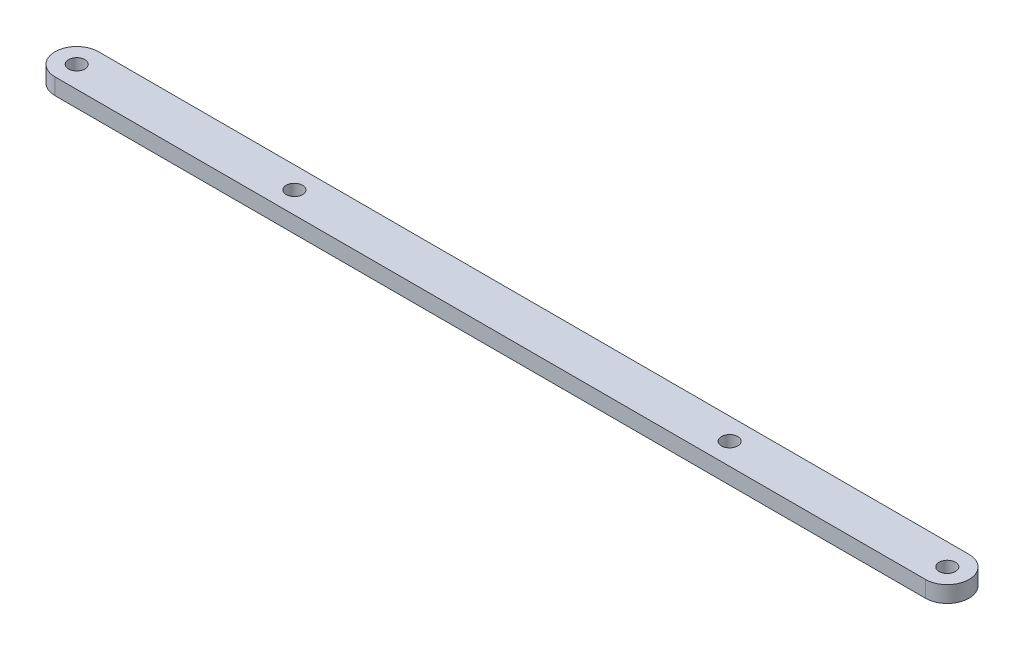
ISO-10303-21;
HEADER;
FILE_DESCRIPTION(('STEP AP214'),'2;1');
FILE_NAME('part.step','',(''),(''),'','','');
FILE_SCHEMA(('AUTOMOTIVE_DESIGN { 1 0 10303 214 1 1 1 1 }'));
ENDSEC;
DATA;
#1=APPLICATION_CONTEXT('core data for automotive mechanical design processes');
#2=APPLICATION_PROTOCOL_DEFINITION('international standard','automotive_design',2000,#1);
#3=PRODUCT_CONTEXT('',#1,'mechanical');
#4=PRODUCT('Part','Part','',(#3));
#5=PRODUCT_RELATED_PRODUCT_CATEGORY('part','',(#4));
#6=PRODUCT_DEFINITION_FORMATION('','',#4);
#7=PRODUCT_DEFINITION_CONTEXT('part definition',#1,'design');
#8=PRODUCT_DEFINITION('design','',#6,#7);
#9=PRODUCT_DEFINITION_SHAPE('','',#8);
#10=(LENGTH_UNIT() NAMED_UNIT(*) SI_UNIT(.MILLI.,.METRE.));
#11=(NAMED_UNIT(*) PLANE_ANGLE_UNIT() SI_UNIT($,.RADIAN.));
#12=(NAMED_UNIT(*) SI_UNIT($,.STERADIAN.) SOLID_ANGLE_UNIT());
#13=UNCERTAINTY_MEASURE_WITH_UNIT(LENGTH_MEASURE(1.E-05),#10,'distance_accuracy_value','');
#14=(GEOMETRIC_REPRESENTATION_CONTEXT(3) GLOBAL_UNCERTAINTY_ASSIGNED_CONTEXT((#13)) GLOBAL_UNIT_ASSIGNED_CONTEXT((#10,
#11,#12)) REPRESENTATION_CONTEXT('',''));
#15=CARTESIAN_POINT('',(0.,0.,0.));
#16=DIRECTION('',(0.,0.,1.));
#17=DIRECTION('',(1.,0.,0.));
#18=AXIS2_PLACEMENT_3D('',#15,#16,#17);
#19=CARTESIAN_POINT('',(0.,3.,0.));
#20=DIRECTION('',(0.,1.,0.));
#21=DIRECTION('',(0.,0.,1.));
#22=AXIS2_PLACEMENT_3D('',#19,#20,#21);
#23=PLANE('',#22);
#24=CARTESIAN_POINT('',(40.,3.,0.));
#25=DIRECTION('',(0.,1.,0.));
#26=DIRECTION('',(0.,0.,1.));
#27=AXIS2_PLACEMENT_3D('',#24,#25,#26);
#28=CIRCLE('',#27,1.5);
#29=CARTESIAN_POINT('',(40.,3.,1.5));
#30=VERTEX_POINT('',#29);
#31=EDGE_CURVE('E133',#30,#30,#28,.T.);
#32=ORIENTED_EDGE('',*,*,#31,.F.);
#33=EDGE_LOOP('',(#32));
#34=FACE_BOUND('',#33,.T.);
#35=CARTESIAN_POINT('',(160.,3.,0.));
#36=DIRECTION('',(0.,1.,0.));
#37=DIRECTION('',(0.,0.,1.));
#38=AXIS2_PLACEMENT_3D('',#35,#36,#37);
#39=CIRCLE('',#38,1.5);
#40=CARTESIAN_POINT('',(160.,3.,1.5));
#41=VERTEX_POINT('',#40);
#42=EDGE_CURVE('E121',#41,#41,#39,.T.);
#43=ORIENTED_EDGE('',*,*,#42,.F.);
#44=EDGE_LOOP('',(#43));
#45=FACE_BOUND('',#44,.T.);
#46=CARTESIAN_POINT('',(0.,3.,0.));
#47=DIRECTION('',(0.,1.,0.));
#48=DIRECTION('',(0.,0.,1.));
#49=AXIS2_PLACEMENT_3D('',#46,#47,#48);
#50=CIRCLE('',#49,4.);
#51=CARTESIAN_POINT('',(0.,3.,-4.));
#52=VERTEX_POINT('',#51);
#53=CARTESIAN_POINT('',(0.,3.,4.));
#54=VERTEX_POINT('',#53);
#55=EDGE_CURVE('E91',#52,#54,#50,.T.);
#56=ORIENTED_EDGE('',*,*,#55,.T.);
#57=DIRECTION('',(1.,0.,0.));
#58=VECTOR('',#57,1.);
#59=CARTESIAN_POINT('',(0.,3.,4.));
#60=LINE('',#59,#58);
#61=CARTESIAN_POINT('',(160.,3.,4.));
#62=VERTEX_POINT('',#61);
#63=EDGE_CURVE('E86',#54,#62,#60,.T.);
#64=ORIENTED_EDGE('',*,*,#63,.T.);
#65=CARTESIAN_POINT('',(160.,3.,0.));
#66=DIRECTION('',(0.,1.,0.));
#67=DIRECTION('',(0.,0.,1.));
#68=AXIS2_PLACEMENT_3D('',#65,#66,#67);
#69=CIRCLE('',#68,4.);
#70=CARTESIAN_POINT('',(160.,3.,-4.));
#71=VERTEX_POINT('',#70);
#72=EDGE_CURVE('E89',#62,#71,#69,.T.);
#73=ORIENTED_EDGE('',*,*,#72,.T.);
#74=DIRECTION('',(-1.,0.,0.));
#75=VECTOR('',#74,1.);
#76=CARTESIAN_POINT('',(0.,3.,-4.));
#77=LINE('',#76,#75);
#78=EDGE_CURVE('E56',#71,#52,#77,.T.);
#79=ORIENTED_EDGE('',*,*,#78,.T.);
#80=EDGE_LOOP('',(#56,#64,#73,#79));
#81=FACE_BOUND('',#80,.T.);
#82=CARTESIAN_POINT('',(0.,3.,0.));
#83=DIRECTION('',(0.,1.,0.));
#84=DIRECTION('',(0.,0.,1.));
#85=AXIS2_PLACEMENT_3D('',#82,#83,#84);
#86=CIRCLE('',#85,1.5);
#87=CARTESIAN_POINT('',(0.,3.,1.5));
#88=VERTEX_POINT('',#87);
#89=EDGE_CURVE('E106',#88,#88,#86,.T.);
#90=ORIENTED_EDGE('',*,*,#89,.F.);
#91=EDGE_LOOP('',(#90));
#92=FACE_BOUND('',#91,.T.);
#93=CARTESIAN_POINT('',(120.,3.,0.));
#94=DIRECTION('',(0.,1.,0.));
#95=DIRECTION('',(0.,0.,1.));
#96=AXIS2_PLACEMENT_3D('',#93,#94,#95);
#97=CIRCLE('',#96,1.5);
#98=CARTESIAN_POINT('',(120.,3.,1.5));
#99=VERTEX_POINT('',#98);
#100=EDGE_CURVE('E127',#99,#99,#97,.T.);
#101=ORIENTED_EDGE('',*,*,#100,.F.);
#102=EDGE_LOOP('',(#101));
#103=FACE_BOUND('',#102,.T.);
#104=ADVANCED_FACE('F39',(#34,#45,#81,#92,#103),#23,.T.);
#105=CARTESIAN_POINT('',(0.,0.,0.));
#106=DIRECTION('',(0.,1.,0.));
#107=DIRECTION('',(0.,0.,1.));
#108=AXIS2_PLACEMENT_3D('',#105,#106,#107);
#109=PLANE('',#108);
#110=CARTESIAN_POINT('',(40.,0.,0.));
#111=DIRECTION('',(0.,1.,0.));
#112=DIRECTION('',(0.,0.,1.));
#113=AXIS2_PLACEMENT_3D('',#110,#111,#112);
#114=CIRCLE('',#113,1.5);
#115=CARTESIAN_POINT('',(40.,0.,1.5));
#116=VERTEX_POINT('',#115);
#117=EDGE_CURVE('E136',#116,#116,#114,.T.);
#118=ORIENTED_EDGE('',*,*,#117,.T.);
#119=EDGE_LOOP('',(#118));
#120=FACE_BOUND('',#119,.T.);
#121=CARTESIAN_POINT('',(0.,0.,0.));
#122=DIRECTION('',(0.,1.,0.));
#123=DIRECTION('',(0.,0.,1.));
#124=AXIS2_PLACEMENT_3D('',#121,#122,#123);
#125=CIRCLE('',#124,4.);
#126=CARTESIAN_POINT('',(0.,0.,-4.));
#127=VERTEX_POINT('',#126);
#128=CARTESIAN_POINT('',(0.,0.,4.));
#129=VERTEX_POINT('',#128);
#130=EDGE_CURVE('E103',#127,#129,#125,.T.);
#131=ORIENTED_EDGE('',*,*,#130,.F.);
#132=DIRECTION('',(-1.,0.,0.));
#133=VECTOR('',#132,1.);
#134=CARTESIAN_POINT('',(0.,0.,-4.));
#135=LINE('',#134,#133);
#136=CARTESIAN_POINT('',(160.,0.,-4.));
#137=VERTEX_POINT('',#136);
#138=EDGE_CURVE('E79',#137,#127,#135,.T.);
#139=ORIENTED_EDGE('',*,*,#138,.F.);
#140=CARTESIAN_POINT('',(160.,0.,0.));
#141=DIRECTION('',(0.,1.,0.));
#142=DIRECTION('',(0.,0.,1.));
#143=AXIS2_PLACEMENT_3D('',#140,#141,#142);
#144=CIRCLE('',#143,4.);
#145=CARTESIAN_POINT('',(160.,0.,4.));
#146=VERTEX_POINT('',#145);
#147=EDGE_CURVE('E73',#146,#137,#144,.T.);
#148=ORIENTED_EDGE('',*,*,#147,.F.);
#149=DIRECTION('',(1.,0.,0.));
#150=VECTOR('',#149,1.);
#151=CARTESIAN_POINT('',(0.,0.,4.));
#152=LINE('',#151,#150);
#153=EDGE_CURVE('E95',#129,#146,#152,.T.);
#154=ORIENTED_EDGE('',*,*,#153,.F.);
#155=EDGE_LOOP('',(#131,#139,#148,#154));
#156=FACE_BOUND('',#155,.T.);
#157=CARTESIAN_POINT('',(0.,0.,0.));
#158=DIRECTION('',(0.,1.,0.));
#159=DIRECTION('',(0.,0.,1.));
#160=AXIS2_PLACEMENT_3D('',#157,#158,#159);
#161=CIRCLE('',#160,1.5);
#162=CARTESIAN_POINT('',(0.,0.,1.5));
#163=VERTEX_POINT('',#162);
#164=EDGE_CURVE('E118',#163,#163,#161,.T.);
#165=ORIENTED_EDGE('',*,*,#164,.T.);
#166=EDGE_LOOP('',(#165));
#167=FACE_BOUND('',#166,.T.);
#168=CARTESIAN_POINT('',(160.,0.,0.));
#169=DIRECTION('',(0.,1.,0.));
#170=DIRECTION('',(0.,0.,1.));
#171=AXIS2_PLACEMENT_3D('',#168,#169,#170);
#172=CIRCLE('',#171,1.5);
#173=CARTESIAN_POINT('',(160.,0.,1.5));
#174=VERTEX_POINT('',#173);
#175=EDGE_CURVE('E124',#174,#174,#172,.T.);
#176=ORIENTED_EDGE('',*,*,#175,.T.);
#177=EDGE_LOOP('',(#176));
#178=FACE_BOUND('',#177,.T.);
#179=CARTESIAN_POINT('',(120.,0.,0.));
#180=DIRECTION('',(0.,1.,0.));
#181=DIRECTION('',(0.,0.,1.));
#182=AXIS2_PLACEMENT_3D('',#179,#180,#181);
#183=CIRCLE('',#182,1.5);
#184=CARTESIAN_POINT('',(120.,0.,1.5));
#185=VERTEX_POINT('',#184);
#186=EDGE_CURVE('E130',#185,#185,#183,.T.);
#187=ORIENTED_EDGE('',*,*,#186,.T.);
#188=EDGE_LOOP('',(#187));
#189=FACE_BOUND('',#188,.T.);
#190=ADVANCED_FACE('F114',(#120,#156,#167,#178,#189),#109,.F.);
#191=CARTESIAN_POINT('',(0.,3.,0.));
#192=DIRECTION('',(0.,-1.,0.));
#193=DIRECTION('',(0.,0.,-1.));
#194=AXIS2_PLACEMENT_3D('',#191,#192,#193);
#195=CYLINDRICAL_SURFACE('',#194,4.);
#196=ORIENTED_EDGE('',*,*,#130,.T.);
#197=DIRECTION('',(0.,-1.,0.));
#198=VECTOR('',#197,1.);
#199=CARTESIAN_POINT('',(0.,3.,4.));
#200=LINE('',#199,#198);
#201=EDGE_CURVE('E11',#54,#129,#200,.T.);
#202=ORIENTED_EDGE('',*,*,#201,.F.);
#203=ORIENTED_EDGE('',*,*,#55,.F.);
#204=DIRECTION('',(0.,-1.,0.));
#205=VECTOR('',#204,1.);
#206=CARTESIAN_POINT('',(0.,3.,-4.));
#207=LINE('',#206,#205);
#208=EDGE_CURVE('E99',#52,#127,#207,.T.);
#209=ORIENTED_EDGE('',*,*,#208,.T.);
#210=EDGE_LOOP('',(#196,#202,#203,#209));
#211=FACE_BOUND('',#210,.T.);
#212=ADVANCED_FACE('F41',(#211),#195,.T.);
#213=CARTESIAN_POINT('',(0.,3.,4.));
#214=DIRECTION('',(0.,0.,-1.));
#215=DIRECTION('',(-1.,0.,0.));
#216=AXIS2_PLACEMENT_3D('',#213,#214,#215);
#217=PLANE('',#216);
#218=ORIENTED_EDGE('',*,*,#153,.T.);
#219=DIRECTION('',(0.,-1.,0.));
#220=VECTOR('',#219,1.);
#221=CARTESIAN_POINT('',(160.,3.,4.));
#222=LINE('',#221,#220);
#223=EDGE_CURVE('E48',#62,#146,#222,.T.);
#224=ORIENTED_EDGE('',*,*,#223,.F.);
#225=ORIENTED_EDGE('',*,*,#63,.F.);
#226=ORIENTED_EDGE('',*,*,#201,.T.);
#227=EDGE_LOOP('',(#218,#224,#225,#226));
#228=FACE_BOUND('',#227,.T.);
#229=ADVANCED_FACE('F94',(#228),#217,.F.);
#230=CARTESIAN_POINT('',(160.,3.,0.));
#231=DIRECTION('',(0.,-1.,0.));
#232=DIRECTION('',(0.,0.,-1.));
#233=AXIS2_PLACEMENT_3D('',#230,#231,#232);
#234=CYLINDRICAL_SURFACE('',#233,4.);
#235=ORIENTED_EDGE('',*,*,#147,.T.);
#236=DIRECTION('',(0.,-1.,0.));
#237=VECTOR('',#236,1.);
#238=CARTESIAN_POINT('',(160.,3.,-4.));
#239=LINE('',#238,#237);
#240=EDGE_CURVE('E96',#71,#137,#239,.T.);
#241=ORIENTED_EDGE('',*,*,#240,.F.);
#242=ORIENTED_EDGE('',*,*,#72,.F.);
#243=ORIENTED_EDGE('',*,*,#223,.T.);
#244=EDGE_LOOP('',(#235,#241,#242,#243));
#245=FACE_BOUND('',#244,.T.);
#246=ADVANCED_FACE('F97',(#245),#234,.T.);
#247=CARTESIAN_POINT('',(0.,3.,-4.));
#248=DIRECTION('',(0.,0.,1.));
#249=DIRECTION('',(1.,0.,0.));
#250=AXIS2_PLACEMENT_3D('',#247,#248,#249);
#251=PLANE('',#250);
#252=ORIENTED_EDGE('',*,*,#138,.T.);
#253=ORIENTED_EDGE('',*,*,#208,.F.);
#254=ORIENTED_EDGE('',*,*,#78,.F.);
#255=ORIENTED_EDGE('',*,*,#240,.T.);
#256=EDGE_LOOP('',(#252,#253,#254,#255));
#257=FACE_BOUND('',#256,.T.);
#258=ADVANCED_FACE('F111',(#257),#251,.F.);
#259=CARTESIAN_POINT('',(0.,3.,0.));
#260=DIRECTION('',(0.,-1.,0.));
#261=DIRECTION('',(0.,0.,-1.));
#262=AXIS2_PLACEMENT_3D('',#259,#260,#261);
#263=CYLINDRICAL_SURFACE('',#262,1.5);
#264=ORIENTED_EDGE('',*,*,#89,.T.);
#265=EDGE_LOOP('',(#264));
#266=FACE_BOUND('',#265,.T.);
#267=ORIENTED_EDGE('',*,*,#164,.F.);
#268=EDGE_LOOP('',(#267));
#269=FACE_BOUND('',#268,.T.);
#270=ADVANCED_FACE('F154',(#266,#269),#263,.F.);
#271=CARTESIAN_POINT('',(160.,3.,0.));
#272=DIRECTION('',(0.,-1.,0.));
#273=DIRECTION('',(0.,0.,-1.));
#274=AXIS2_PLACEMENT_3D('',#271,#272,#273);
#275=CYLINDRICAL_SURFACE('',#274,1.5);
#276=ORIENTED_EDGE('',*,*,#42,.T.);
#277=EDGE_LOOP('',(#276));
#278=FACE_BOUND('',#277,.T.);
#279=ORIENTED_EDGE('',*,*,#175,.F.);
#280=EDGE_LOOP('',(#279));
#281=FACE_BOUND('',#280,.T.);
#282=ADVANCED_FACE('F150',(#278,#281),#275,.F.);
#283=CARTESIAN_POINT('',(120.,3.,0.));
#284=DIRECTION('',(0.,-1.,0.));
#285=DIRECTION('',(0.,0.,-1.));
#286=AXIS2_PLACEMENT_3D('',#283,#284,#285);
#287=CYLINDRICAL_SURFACE('',#286,1.5);
#288=ORIENTED_EDGE('',*,*,#100,.T.);
#289=EDGE_LOOP('',(#288));
#290=FACE_BOUND('',#289,.T.);
#291=ORIENTED_EDGE('',*,*,#186,.F.);
#292=EDGE_LOOP('',(#291));
#293=FACE_BOUND('',#292,.T.);
#294=ADVANCED_FACE('F153',(#290,#293),#287,.F.);
#295=CARTESIAN_POINT('',(40.,3.,0.));
#296=DIRECTION('',(0.,-1.,0.));
#297=DIRECTION('',(0.,0.,-1.));
#298=AXIS2_PLACEMENT_3D('',#295,#296,#297);
#299=CYLINDRICAL_SURFACE('',#298,1.5);
#300=ORIENTED_EDGE('',*,*,#31,.T.);
#301=EDGE_LOOP('',(#300));
#302=FACE_BOUND('',#301,.T.);
#303=ORIENTED_EDGE('',*,*,#117,.F.);
#304=EDGE_LOOP('',(#303));
#305=FACE_BOUND('',#304,.T.);
#306=ADVANCED_FACE('F142',(#302,#305),#299,.F.);
#307=CLOSED_SHELL('',(#104,#190,#212,#229,#246,#258,#270,#282,#294,#306));
#308=MANIFOLD_SOLID_BREP('B2',#307);
#309=ADVANCED_BREP_SHAPE_REPRESENTATION('',(#18,#308),#14);
#310=SHAPE_DEFINITION_REPRESENTATION(#9,#309);
ENDSEC;
END-ISO-10303-21;
